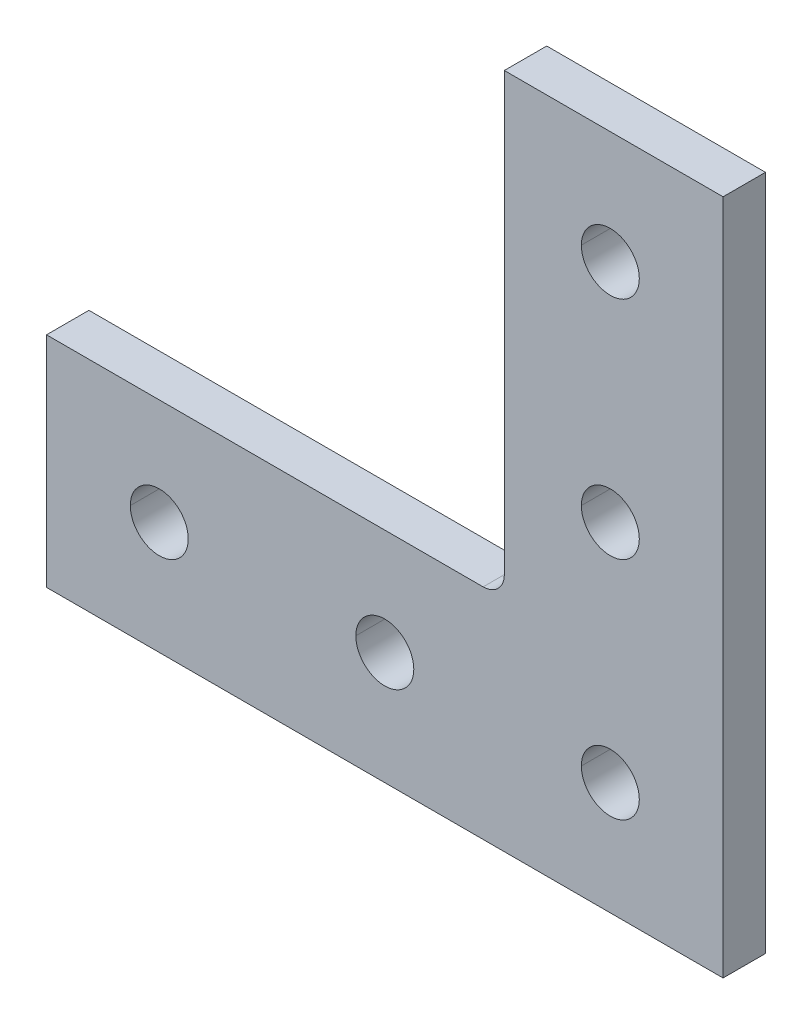
ISO-10303-21;
HEADER;
FILE_DESCRIPTION(('STEP AP214'),'2;1');
FILE_NAME('part.step','',(''),(''),'','','');
FILE_SCHEMA(('AUTOMOTIVE_DESIGN { 1 0 10303 214 1 1 1 1 }'));
ENDSEC;
DATA;
#1=APPLICATION_CONTEXT('core data for automotive mechanical design processes');
#2=APPLICATION_PROTOCOL_DEFINITION('international standard','automotive_design',2000,#1);
#3=PRODUCT_CONTEXT('',#1,'mechanical');
#4=PRODUCT('Part','Part','',(#3));
#5=PRODUCT_RELATED_PRODUCT_CATEGORY('part','',(#4));
#6=PRODUCT_DEFINITION_FORMATION('','',#4);
#7=PRODUCT_DEFINITION_CONTEXT('part definition',#1,'design');
#8=PRODUCT_DEFINITION('design','',#6,#7);
#9=PRODUCT_DEFINITION_SHAPE('','',#8);
#10=(LENGTH_UNIT() NAMED_UNIT(*) SI_UNIT(.MILLI.,.METRE.));
#11=(NAMED_UNIT(*) PLANE_ANGLE_UNIT() SI_UNIT($,.RADIAN.));
#12=(NAMED_UNIT(*) SI_UNIT($,.STERADIAN.) SOLID_ANGLE_UNIT());
#13=UNCERTAINTY_MEASURE_WITH_UNIT(LENGTH_MEASURE(1.E-05),#10,'distance_accuracy_value','');
#14=(GEOMETRIC_REPRESENTATION_CONTEXT(3) GLOBAL_UNCERTAINTY_ASSIGNED_CONTEXT((#13)) GLOBAL_UNIT_ASSIGNED_CONTEXT((#10,
#11,#12)) REPRESENTATION_CONTEXT('',''));
#15=CARTESIAN_POINT('',(0.,0.,0.));
#16=DIRECTION('',(0.,0.,1.));
#17=DIRECTION('',(1.,0.,0.));
#18=AXIS2_PLACEMENT_3D('',#15,#16,#17);
#19=CARTESIAN_POINT('',(-27.0256,24.638,4.7752));
#20=DIRECTION('',(0.,-1.,0.));
#21=DIRECTION('',(0.,0.,-1.));
#22=AXIS2_PLACEMENT_3D('',#19,#20,#21);
#23=PLANE('',#22);
#24=DIRECTION('',(-1.,0.,0.));
#25=VECTOR('',#24,1.);
#26=CARTESIAN_POINT('',(-27.0256,24.638,0.));
#27=LINE('',#26,#25);
#28=CARTESIAN_POINT('',(-27.0256,24.638,0.));
#29=VERTEX_POINT('',#28);
#30=CARTESIAN_POINT('',(-76.2,24.638,0.));
#31=VERTEX_POINT('',#30);
#32=EDGE_CURVE('E11',#29,#31,#27,.T.);
#33=ORIENTED_EDGE('',*,*,#32,.T.);
#34=DIRECTION('',(0.,0.,-1.));
#35=VECTOR('',#34,1.);
#36=CARTESIAN_POINT('',(-76.2,24.638,4.7752));
#37=LINE('',#36,#35);
#38=CARTESIAN_POINT('',(-76.2,24.638,4.7752));
#39=VERTEX_POINT('',#38);
#40=EDGE_CURVE('E25',#39,#31,#37,.T.);
#41=ORIENTED_EDGE('',*,*,#40,.F.);
#42=DIRECTION('',(-1.,0.,0.));
#43=VECTOR('',#42,1.);
#44=CARTESIAN_POINT('',(-27.0256,24.638,4.7752));
#45=LINE('',#44,#43);
#46=CARTESIAN_POINT('',(-27.0256,24.638,4.7752));
#47=VERTEX_POINT('',#46);
#48=EDGE_CURVE('E334',#47,#39,#45,.T.);
#49=ORIENTED_EDGE('',*,*,#48,.F.);
#50=DIRECTION('',(0.,0.,-1.));
#51=VECTOR('',#50,1.);
#52=CARTESIAN_POINT('',(-27.0256,24.638,4.7752));
#53=LINE('',#52,#51);
#54=EDGE_CURVE('E330',#47,#29,#53,.T.);
#55=ORIENTED_EDGE('',*,*,#54,.T.);
#56=EDGE_LOOP('',(#33,#41,#49,#55));
#57=FACE_BOUND('',#56,.T.);
#58=ADVANCED_FACE('F17',(#57),#23,.F.);
#59=CARTESIAN_POINT('',(-27.0255999999996,27.0255999999996,4.7752));
#60=DIRECTION('',(0.,0.,-1.));
#61=DIRECTION('',(-0.707106781186548,0.707106781186548,0.));
#62=AXIS2_PLACEMENT_3D('',#59,#60,#61);
#63=CYLINDRICAL_SURFACE('',#62,2.38759999999961);
#64=CARTESIAN_POINT('',(-27.0255999999996,27.0255999999996,0.));
#65=DIRECTION('',(0.,0.,1.));
#66=DIRECTION('',(1.,0.,0.));
#67=AXIS2_PLACEMENT_3D('',#64,#65,#66);
#68=CIRCLE('',#67,2.38759999999961);
#69=CARTESIAN_POINT('',(-24.638,27.0256,0.));
#70=VERTEX_POINT('',#69);
#71=EDGE_CURVE('E325',#29,#70,#68,.T.);
#72=ORIENTED_EDGE('',*,*,#71,.F.);
#73=ORIENTED_EDGE('',*,*,#54,.F.);
#74=CARTESIAN_POINT('',(-27.0255999999996,27.0255999999996,4.7752));
#75=DIRECTION('',(0.,0.,1.));
#76=DIRECTION('',(1.,0.,0.));
#77=AXIS2_PLACEMENT_3D('',#74,#75,#76);
#78=CIRCLE('',#77,2.38759999999961);
#79=CARTESIAN_POINT('',(-24.638,27.0256,4.7752));
#80=VERTEX_POINT('',#79);
#81=EDGE_CURVE('E321',#47,#80,#78,.T.);
#82=ORIENTED_EDGE('',*,*,#81,.T.);
#83=DIRECTION('',(0.,0.,-1.));
#84=VECTOR('',#83,1.);
#85=CARTESIAN_POINT('',(-24.638,27.0256,4.7752));
#86=LINE('',#85,#84);
#87=EDGE_CURVE('E317',#80,#70,#86,.T.);
#88=ORIENTED_EDGE('',*,*,#87,.T.);
#89=EDGE_LOOP('',(#72,#73,#82,#88));
#90=FACE_BOUND('',#89,.T.);
#91=ADVANCED_FACE('F353',(#90),#63,.F.);
#92=CARTESIAN_POINT('',(-24.638,76.2,4.7752));
#93=DIRECTION('',(1.,0.,0.));
#94=DIRECTION('',(0.,0.,-1.));
#95=AXIS2_PLACEMENT_3D('',#92,#93,#94);
#96=PLANE('',#95);
#97=DIRECTION('',(0.,-1.,0.));
#98=VECTOR('',#97,1.);
#99=CARTESIAN_POINT('',(-24.638,76.2,0.));
#100=LINE('',#99,#98);
#101=CARTESIAN_POINT('',(-24.638,76.2,0.));
#102=VERTEX_POINT('',#101);
#103=EDGE_CURVE('E312',#102,#70,#100,.T.);
#104=ORIENTED_EDGE('',*,*,#103,.T.);
#105=ORIENTED_EDGE('',*,*,#87,.F.);
#106=DIRECTION('',(0.,-1.,0.));
#107=VECTOR('',#106,1.);
#108=CARTESIAN_POINT('',(-24.638,76.2,4.7752));
#109=LINE('',#108,#107);
#110=CARTESIAN_POINT('',(-24.638,76.2,4.7752));
#111=VERTEX_POINT('',#110);
#112=EDGE_CURVE('E307',#111,#80,#109,.T.);
#113=ORIENTED_EDGE('',*,*,#112,.F.);
#114=DIRECTION('',(0.,0.,-1.));
#115=VECTOR('',#114,1.);
#116=CARTESIAN_POINT('',(-24.638,76.2,4.7752));
#117=LINE('',#116,#115);
#118=EDGE_CURVE('E303',#111,#102,#117,.T.);
#119=ORIENTED_EDGE('',*,*,#118,.T.);
#120=EDGE_LOOP('',(#104,#105,#113,#119));
#121=FACE_BOUND('',#120,.T.);
#122=ADVANCED_FACE('F369',(#121),#96,.F.);
#123=CARTESIAN_POINT('',(0.,76.2,4.7752));
#124=DIRECTION('',(0.,-1.,0.));
#125=DIRECTION('',(0.,0.,-1.));
#126=AXIS2_PLACEMENT_3D('',#123,#124,#125);
#127=PLANE('',#126);
#128=DIRECTION('',(-1.,0.,0.));
#129=VECTOR('',#128,1.);
#130=CARTESIAN_POINT('',(0.,76.2,0.));
#131=LINE('',#130,#129);
#132=CARTESIAN_POINT('',(0.,76.2,0.));
#133=VERTEX_POINT('',#132);
#134=EDGE_CURVE('E298',#133,#102,#131,.T.);
#135=ORIENTED_EDGE('',*,*,#134,.T.);
#136=ORIENTED_EDGE('',*,*,#118,.F.);
#137=DIRECTION('',(-1.,0.,0.));
#138=VECTOR('',#137,1.);
#139=CARTESIAN_POINT('',(0.,76.2,4.7752));
#140=LINE('',#139,#138);
#141=CARTESIAN_POINT('',(0.,76.2,4.7752));
#142=VERTEX_POINT('',#141);
#143=EDGE_CURVE('E293',#142,#111,#140,.T.);
#144=ORIENTED_EDGE('',*,*,#143,.F.);
#145=DIRECTION('',(0.,0.,-1.));
#146=VECTOR('',#145,1.);
#147=CARTESIAN_POINT('',(0.,76.2,4.7752));
#148=LINE('',#147,#146);
#149=EDGE_CURVE('E289',#142,#133,#148,.T.);
#150=ORIENTED_EDGE('',*,*,#149,.T.);
#151=EDGE_LOOP('',(#135,#136,#144,#150));
#152=FACE_BOUND('',#151,.T.);
#153=ADVANCED_FACE('F367',(#152),#127,.F.);
#154=CARTESIAN_POINT('',(0.,0.,4.7752));
#155=DIRECTION('',(-1.,0.,0.));
#156=DIRECTION('',(0.,0.,1.));
#157=AXIS2_PLACEMENT_3D('',#154,#155,#156);
#158=PLANE('',#157);
#159=DIRECTION('',(0.,1.,0.));
#160=VECTOR('',#159,1.);
#161=CARTESIAN_POINT('',(0.,0.,0.));
#162=LINE('',#161,#160);
#163=CARTESIAN_POINT('',(0.,0.,0.));
#164=VERTEX_POINT('',#163);
#165=EDGE_CURVE('E284',#164,#133,#162,.T.);
#166=ORIENTED_EDGE('',*,*,#165,.T.);
#167=ORIENTED_EDGE('',*,*,#149,.F.);
#168=DIRECTION('',(0.,1.,0.));
#169=VECTOR('',#168,1.);
#170=CARTESIAN_POINT('',(0.,0.,4.7752));
#171=LINE('',#170,#169);
#172=CARTESIAN_POINT('',(0.,0.,4.7752));
#173=VERTEX_POINT('',#172);
#174=EDGE_CURVE('E279',#173,#142,#171,.T.);
#175=ORIENTED_EDGE('',*,*,#174,.F.);
#176=DIRECTION('',(0.,0.,-1.));
#177=VECTOR('',#176,1.);
#178=CARTESIAN_POINT('',(0.,0.,4.7752));
#179=LINE('',#178,#177);
#180=EDGE_CURVE('E275',#173,#164,#179,.T.);
#181=ORIENTED_EDGE('',*,*,#180,.T.);
#182=EDGE_LOOP('',(#166,#167,#175,#181));
#183=FACE_BOUND('',#182,.T.);
#184=ADVANCED_FACE('F365',(#183),#158,.F.);
#185=CARTESIAN_POINT('',(-76.2,0.,4.7752));
#186=DIRECTION('',(0.,1.,0.));
#187=DIRECTION('',(0.,0.,1.));
#188=AXIS2_PLACEMENT_3D('',#185,#186,#187);
#189=PLANE('',#188);
#190=DIRECTION('',(1.,0.,0.));
#191=VECTOR('',#190,1.);
#192=CARTESIAN_POINT('',(-76.2,0.,0.));
#193=LINE('',#192,#191);
#194=CARTESIAN_POINT('',(-76.2,0.,0.));
#195=VERTEX_POINT('',#194);
#196=EDGE_CURVE('E270',#195,#164,#193,.T.);
#197=ORIENTED_EDGE('',*,*,#196,.T.);
#198=ORIENTED_EDGE('',*,*,#180,.F.);
#199=DIRECTION('',(1.,0.,0.));
#200=VECTOR('',#199,1.);
#201=CARTESIAN_POINT('',(-76.2,0.,4.7752));
#202=LINE('',#201,#200);
#203=CARTESIAN_POINT('',(-76.2,0.,4.7752));
#204=VERTEX_POINT('',#203);
#205=EDGE_CURVE('E265',#204,#173,#202,.T.);
#206=ORIENTED_EDGE('',*,*,#205,.F.);
#207=DIRECTION('',(0.,0.,-1.));
#208=VECTOR('',#207,1.);
#209=CARTESIAN_POINT('',(-76.2,0.,4.7752));
#210=LINE('',#209,#208);
#211=EDGE_CURVE('E261',#204,#195,#210,.T.);
#212=ORIENTED_EDGE('',*,*,#211,.T.);
#213=EDGE_LOOP('',(#197,#198,#206,#212));
#214=FACE_BOUND('',#213,.T.);
#215=ADVANCED_FACE('F361',(#214),#189,.F.);
#216=CARTESIAN_POINT('',(-76.2,24.638,4.7752));
#217=DIRECTION('',(1.,0.,0.));
#218=DIRECTION('',(0.,0.,-1.));
#219=AXIS2_PLACEMENT_3D('',#216,#217,#218);
#220=PLANE('',#219);
#221=DIRECTION('',(0.,-1.,0.));
#222=VECTOR('',#221,1.);
#223=CARTESIAN_POINT('',(-76.2,24.638,0.));
#224=LINE('',#223,#222);
#225=EDGE_CURVE('E256',#31,#195,#224,.T.);
#226=ORIENTED_EDGE('',*,*,#225,.T.);
#227=ORIENTED_EDGE('',*,*,#211,.F.);
#228=DIRECTION('',(0.,-1.,0.));
#229=VECTOR('',#228,1.);
#230=CARTESIAN_POINT('',(-76.2,24.638,4.7752));
#231=LINE('',#230,#229);
#232=EDGE_CURVE('E251',#39,#204,#231,.T.);
#233=ORIENTED_EDGE('',*,*,#232,.F.);
#234=ORIENTED_EDGE('',*,*,#40,.T.);
#235=EDGE_LOOP('',(#226,#227,#233,#234));
#236=FACE_BOUND('',#235,.T.);
#237=ADVANCED_FACE('F344',(#236),#220,.F.);
#238=CARTESIAN_POINT('',(-27.0255999999996,27.0255999999996,4.7752));
#239=DIRECTION('',(0.,0.,1.));
#240=DIRECTION('',(1.,0.,0.));
#241=AXIS2_PLACEMENT_3D('',#238,#239,#240);
#242=PLANE('',#241);
#243=CARTESIAN_POINT('',(-63.5,12.7,4.7752));
#244=DIRECTION('',(0.,0.,1.));
#245=DIRECTION('',(1.,0.,0.));
#246=AXIS2_PLACEMENT_3D('',#243,#244,#245);
#247=CIRCLE('',#246,3.2639);
#248=CARTESIAN_POINT('',(-66.7639,12.7,4.7752));
#249=VERTEX_POINT('',#248);
#250=CARTESIAN_POINT('',(-60.2361,12.7,4.7752));
#251=VERTEX_POINT('',#250);
#252=EDGE_CURVE('E246',#249,#251,#247,.T.);
#253=ORIENTED_EDGE('',*,*,#252,.F.);
#254=CARTESIAN_POINT('',(-63.5,12.7,4.7752));
#255=DIRECTION('',(0.,0.,1.));
#256=DIRECTION('',(1.,0.,0.));
#257=AXIS2_PLACEMENT_3D('',#254,#255,#256);
#258=CIRCLE('',#257,3.2639);
#259=EDGE_CURVE('E241',#251,#249,#258,.T.);
#260=ORIENTED_EDGE('',*,*,#259,.F.);
#261=EDGE_LOOP('',(#253,#260));
#262=FACE_BOUND('',#261,.T.);
#263=CARTESIAN_POINT('',(-38.1,12.7,4.7752));
#264=DIRECTION('',(0.,0.,1.));
#265=DIRECTION('',(1.,0.,0.));
#266=AXIS2_PLACEMENT_3D('',#263,#264,#265);
#267=CIRCLE('',#266,3.2639);
#268=CARTESIAN_POINT('',(-41.3639,12.7,4.7752));
#269=VERTEX_POINT('',#268);
#270=CARTESIAN_POINT('',(-34.8361,12.7,4.7752));
#271=VERTEX_POINT('',#270);
#272=EDGE_CURVE('E236',#269,#271,#267,.T.);
#273=ORIENTED_EDGE('',*,*,#272,.F.);
#274=CARTESIAN_POINT('',(-38.1,12.7,4.7752));
#275=DIRECTION('',(0.,0.,1.));
#276=DIRECTION('',(1.,0.,0.));
#277=AXIS2_PLACEMENT_3D('',#274,#275,#276);
#278=CIRCLE('',#277,3.2639);
#279=EDGE_CURVE('E231',#271,#269,#278,.T.);
#280=ORIENTED_EDGE('',*,*,#279,.F.);
#281=EDGE_LOOP('',(#273,#280));
#282=FACE_BOUND('',#281,.T.);
#283=CARTESIAN_POINT('',(-12.7,38.1,4.7752));
#284=DIRECTION('',(0.,0.,1.));
#285=DIRECTION('',(1.,0.,0.));
#286=AXIS2_PLACEMENT_3D('',#283,#284,#285);
#287=CIRCLE('',#286,3.2639);
#288=CARTESIAN_POINT('',(-15.9639,38.1,4.7752));
#289=VERTEX_POINT('',#288);
#290=CARTESIAN_POINT('',(-9.4361,38.1,4.7752));
#291=VERTEX_POINT('',#290);
#292=EDGE_CURVE('E226',#289,#291,#287,.T.);
#293=ORIENTED_EDGE('',*,*,#292,.F.);
#294=CARTESIAN_POINT('',(-12.7,38.1,4.7752));
#295=DIRECTION('',(0.,0.,1.));
#296=DIRECTION('',(1.,0.,0.));
#297=AXIS2_PLACEMENT_3D('',#294,#295,#296);
#298=CIRCLE('',#297,3.2639);
#299=EDGE_CURVE('E221',#291,#289,#298,.T.);
#300=ORIENTED_EDGE('',*,*,#299,.F.);
#301=EDGE_LOOP('',(#293,#300));
#302=FACE_BOUND('',#301,.T.);
#303=CARTESIAN_POINT('',(-12.7,63.5,4.7752));
#304=DIRECTION('',(0.,0.,1.));
#305=DIRECTION('',(1.,0.,0.));
#306=AXIS2_PLACEMENT_3D('',#303,#304,#305);
#307=CIRCLE('',#306,3.2639);
#308=CARTESIAN_POINT('',(-15.9639,63.5,4.7752));
#309=VERTEX_POINT('',#308);
#310=CARTESIAN_POINT('',(-9.4361,63.5,4.7752));
#311=VERTEX_POINT('',#310);
#312=EDGE_CURVE('E152',#309,#311,#307,.T.);
#313=ORIENTED_EDGE('',*,*,#312,.F.);
#314=CARTESIAN_POINT('',(-12.7,63.5,4.7752));
#315=DIRECTION('',(0.,0.,1.));
#316=DIRECTION('',(1.,0.,0.));
#317=AXIS2_PLACEMENT_3D('',#314,#315,#316);
#318=CIRCLE('',#317,3.2639);
#319=EDGE_CURVE('E214',#311,#309,#318,.T.);
#320=ORIENTED_EDGE('',*,*,#319,.F.);
#321=EDGE_LOOP('',(#313,#320));
#322=FACE_BOUND('',#321,.T.);
#323=CARTESIAN_POINT('',(-12.7,12.7,4.7752));
#324=DIRECTION('',(0.,0.,1.));
#325=DIRECTION('',(1.,0.,0.));
#326=AXIS2_PLACEMENT_3D('',#323,#324,#325);
#327=CIRCLE('',#326,3.2639);
#328=CARTESIAN_POINT('',(-15.9639,12.7,4.7752));
#329=VERTEX_POINT('',#328);
#330=CARTESIAN_POINT('',(-9.4361,12.7,4.7752));
#331=VERTEX_POINT('',#330);
#332=EDGE_CURVE('E209',#329,#331,#327,.T.);
#333=ORIENTED_EDGE('',*,*,#332,.F.);
#334=CARTESIAN_POINT('',(-12.7,12.7,4.7752));
#335=DIRECTION('',(0.,0.,1.));
#336=DIRECTION('',(1.,0.,0.));
#337=AXIS2_PLACEMENT_3D('',#334,#335,#336);
#338=CIRCLE('',#337,3.2639);
#339=EDGE_CURVE('E204',#331,#329,#338,.T.);
#340=ORIENTED_EDGE('',*,*,#339,.F.);
#341=EDGE_LOOP('',(#333,#340));
#342=FACE_BOUND('',#341,.T.);
#343=ORIENTED_EDGE('',*,*,#48,.T.);
#344=ORIENTED_EDGE('',*,*,#232,.T.);
#345=ORIENTED_EDGE('',*,*,#205,.T.);
#346=ORIENTED_EDGE('',*,*,#174,.T.);
#347=ORIENTED_EDGE('',*,*,#143,.T.);
#348=ORIENTED_EDGE('',*,*,#112,.T.);
#349=ORIENTED_EDGE('',*,*,#81,.F.);
#350=EDGE_LOOP('',(#343,#344,#345,#346,#347,#348,#349));
#351=FACE_BOUND('',#350,.T.);
#352=ADVANCED_FACE('F349',(#262,#282,#302,#322,#342,#351),#242,.T.);
#353=CARTESIAN_POINT('',(-12.7,12.7,4.7752));
#354=DIRECTION('',(0.,0.,-1.));
#355=DIRECTION('',(0.,-1.,0.));
#356=AXIS2_PLACEMENT_3D('',#353,#354,#355);
#357=CYLINDRICAL_SURFACE('',#356,3.2639);
#358=DIRECTION('',(0.,0.,-1.));
#359=VECTOR('',#358,1.);
#360=CARTESIAN_POINT('',(-9.4361,12.7,4.7752));
#361=LINE('',#360,#359);
#362=CARTESIAN_POINT('',(-9.4361,12.7,0.));
#363=VERTEX_POINT('',#362);
#364=EDGE_CURVE('E199',#331,#363,#361,.T.);
#365=ORIENTED_EDGE('',*,*,#364,.F.);
#366=ORIENTED_EDGE('',*,*,#339,.T.);
#367=DIRECTION('',(0.,0.,-1.));
#368=VECTOR('',#367,1.);
#369=CARTESIAN_POINT('',(-15.9639,12.7,4.7752));
#370=LINE('',#369,#368);
#371=CARTESIAN_POINT('',(-15.9639,12.7,0.));
#372=VERTEX_POINT('',#371);
#373=EDGE_CURVE('E195',#329,#372,#370,.T.);
#374=ORIENTED_EDGE('',*,*,#373,.T.);
#375=CARTESIAN_POINT('',(-12.7,12.7,0.));
#376=DIRECTION('',(0.,0.,1.));
#377=DIRECTION('',(1.,0.,0.));
#378=AXIS2_PLACEMENT_3D('',#375,#376,#377);
#379=CIRCLE('',#378,3.2639);
#380=EDGE_CURVE('E190',#363,#372,#379,.T.);
#381=ORIENTED_EDGE('',*,*,#380,.F.);
#382=EDGE_LOOP('',(#365,#366,#374,#381));
#383=FACE_BOUND('',#382,.T.);
#384=ADVANCED_FACE('F439',(#383),#357,.F.);
#385=CARTESIAN_POINT('',(-27.0255999999996,27.0255999999996,0.));
#386=DIRECTION('',(0.,0.,1.));
#387=DIRECTION('',(1.,0.,0.));
#388=AXIS2_PLACEMENT_3D('',#385,#386,#387);
#389=PLANE('',#388);
#390=CARTESIAN_POINT('',(-63.5,12.7,0.));
#391=DIRECTION('',(0.,0.,1.));
#392=DIRECTION('',(1.,0.,0.));
#393=AXIS2_PLACEMENT_3D('',#390,#391,#392);
#394=CIRCLE('',#393,3.2639);
#395=CARTESIAN_POINT('',(-60.2361,12.7,0.));
#396=VERTEX_POINT('',#395);
#397=CARTESIAN_POINT('',(-66.7639,12.7,0.));
#398=VERTEX_POINT('',#397);
#399=EDGE_CURVE('E186',#396,#398,#394,.T.);
#400=ORIENTED_EDGE('',*,*,#399,.T.);
#401=CARTESIAN_POINT('',(-63.5,12.7,0.));
#402=DIRECTION('',(0.,0.,1.));
#403=DIRECTION('',(1.,0.,0.));
#404=AXIS2_PLACEMENT_3D('',#401,#402,#403);
#405=CIRCLE('',#404,3.2639);
#406=EDGE_CURVE('E182',#398,#396,#405,.T.);
#407=ORIENTED_EDGE('',*,*,#406,.T.);
#408=EDGE_LOOP('',(#400,#407));
#409=FACE_BOUND('',#408,.T.);
#410=CARTESIAN_POINT('',(-38.1,12.7,0.));
#411=DIRECTION('',(0.,0.,1.));
#412=DIRECTION('',(1.,0.,0.));
#413=AXIS2_PLACEMENT_3D('',#410,#411,#412);
#414=CIRCLE('',#413,3.2639);
#415=CARTESIAN_POINT('',(-34.8361,12.7,0.));
#416=VERTEX_POINT('',#415);
#417=CARTESIAN_POINT('',(-41.3639,12.7,0.));
#418=VERTEX_POINT('',#417);
#419=EDGE_CURVE('E178',#416,#418,#414,.T.);
#420=ORIENTED_EDGE('',*,*,#419,.T.);
#421=CARTESIAN_POINT('',(-38.1,12.7,0.));
#422=DIRECTION('',(0.,0.,1.));
#423=DIRECTION('',(1.,0.,0.));
#424=AXIS2_PLACEMENT_3D('',#421,#422,#423);
#425=CIRCLE('',#424,3.2639);
#426=EDGE_CURVE('E174',#418,#416,#425,.T.);
#427=ORIENTED_EDGE('',*,*,#426,.T.);
#428=EDGE_LOOP('',(#420,#427));
#429=FACE_BOUND('',#428,.T.);
#430=CARTESIAN_POINT('',(-12.7,38.1,0.));
#431=DIRECTION('',(0.,0.,1.));
#432=DIRECTION('',(1.,0.,0.));
#433=AXIS2_PLACEMENT_3D('',#430,#431,#432);
#434=CIRCLE('',#433,3.2639);
#435=CARTESIAN_POINT('',(-9.4361,38.1,0.));
#436=VERTEX_POINT('',#435);
#437=CARTESIAN_POINT('',(-15.9639,38.1,0.));
#438=VERTEX_POINT('',#437);
#439=EDGE_CURVE('E170',#436,#438,#434,.T.);
#440=ORIENTED_EDGE('',*,*,#439,.T.);
#441=CARTESIAN_POINT('',(-12.7,38.1,0.));
#442=DIRECTION('',(0.,0.,1.));
#443=DIRECTION('',(1.,0.,0.));
#444=AXIS2_PLACEMENT_3D('',#441,#442,#443);
#445=CIRCLE('',#444,3.2639);
#446=EDGE_CURVE('E149',#438,#436,#445,.T.);
#447=ORIENTED_EDGE('',*,*,#446,.T.);
#448=EDGE_LOOP('',(#440,#447));
#449=FACE_BOUND('',#448,.T.);
#450=CARTESIAN_POINT('',(-12.7,63.5,0.));
#451=DIRECTION('',(0.,0.,1.));
#452=DIRECTION('',(1.,0.,0.));
#453=AXIS2_PLACEMENT_3D('',#450,#451,#452);
#454=CIRCLE('',#453,3.2639);
#455=CARTESIAN_POINT('',(-9.4361,63.5,0.));
#456=VERTEX_POINT('',#455);
#457=CARTESIAN_POINT('',(-15.9639,63.5,0.));
#458=VERTEX_POINT('',#457);
#459=EDGE_CURVE('E135',#456,#458,#454,.T.);
#460=ORIENTED_EDGE('',*,*,#459,.T.);
#461=CARTESIAN_POINT('',(-12.7,63.5,0.));
#462=DIRECTION('',(0.,0.,1.));
#463=DIRECTION('',(1.,0.,0.));
#464=AXIS2_PLACEMENT_3D('',#461,#462,#463);
#465=CIRCLE('',#464,3.2639);
#466=EDGE_CURVE('E131',#458,#456,#465,.T.);
#467=ORIENTED_EDGE('',*,*,#466,.T.);
#468=EDGE_LOOP('',(#460,#467));
#469=FACE_BOUND('',#468,.T.);
#470=ORIENTED_EDGE('',*,*,#380,.T.);
#471=CARTESIAN_POINT('',(-12.7,12.7,0.));
#472=DIRECTION('',(0.,0.,1.));
#473=DIRECTION('',(1.,0.,0.));
#474=AXIS2_PLACEMENT_3D('',#471,#472,#473);
#475=CIRCLE('',#474,3.2639);
#476=EDGE_CURVE('E140',#372,#363,#475,.T.);
#477=ORIENTED_EDGE('',*,*,#476,.T.);
#478=EDGE_LOOP('',(#470,#477));
#479=FACE_BOUND('',#478,.T.);
#480=ORIENTED_EDGE('',*,*,#32,.F.);
#481=ORIENTED_EDGE('',*,*,#71,.T.);
#482=ORIENTED_EDGE('',*,*,#103,.F.);
#483=ORIENTED_EDGE('',*,*,#134,.F.);
#484=ORIENTED_EDGE('',*,*,#165,.F.);
#485=ORIENTED_EDGE('',*,*,#196,.F.);
#486=ORIENTED_EDGE('',*,*,#225,.F.);
#487=EDGE_LOOP('',(#480,#481,#482,#483,#484,#485,#486));
#488=FACE_BOUND('',#487,.T.);
#489=ADVANCED_FACE('F133',(#409,#429,#449,#469,#479,#488),#389,.F.);
#490=CARTESIAN_POINT('',(-12.7,12.7,4.7752));
#491=DIRECTION('',(0.,0.,-1.));
#492=DIRECTION('',(0.,1.,0.));
#493=AXIS2_PLACEMENT_3D('',#490,#491,#492);
#494=CYLINDRICAL_SURFACE('',#493,3.2639);
#495=ORIENTED_EDGE('',*,*,#364,.T.);
#496=ORIENTED_EDGE('',*,*,#476,.F.);
#497=ORIENTED_EDGE('',*,*,#373,.F.);
#498=ORIENTED_EDGE('',*,*,#332,.T.);
#499=EDGE_LOOP('',(#495,#496,#497,#498));
#500=FACE_BOUND('',#499,.T.);
#501=ADVANCED_FACE('F460',(#500),#494,.F.);
#502=CARTESIAN_POINT('',(-12.7,63.5,4.7752));
#503=DIRECTION('',(0.,0.,-1.));
#504=DIRECTION('',(0.,1.,0.));
#505=AXIS2_PLACEMENT_3D('',#502,#503,#504);
#506=CYLINDRICAL_SURFACE('',#505,3.2639);
#507=DIRECTION('',(0.,0.,-1.));
#508=VECTOR('',#507,1.);
#509=CARTESIAN_POINT('',(-9.4361,63.5,4.7752));
#510=LINE('',#509,#508);
#511=EDGE_CURVE('E146',#311,#456,#510,.T.);
#512=ORIENTED_EDGE('',*,*,#511,.T.);
#513=ORIENTED_EDGE('',*,*,#466,.F.);
#514=DIRECTION('',(0.,0.,-1.));
#515=VECTOR('',#514,1.);
#516=CARTESIAN_POINT('',(-15.9639,63.5,4.7752));
#517=LINE('',#516,#515);
#518=EDGE_CURVE('E148',#309,#458,#517,.T.);
#519=ORIENTED_EDGE('',*,*,#518,.F.);
#520=ORIENTED_EDGE('',*,*,#312,.T.);
#521=EDGE_LOOP('',(#512,#513,#519,#520));
#522=FACE_BOUND('',#521,.T.);
#523=ADVANCED_FACE('F151',(#522),#506,.F.);
#524=CARTESIAN_POINT('',(-12.7,63.5,4.7752));
#525=DIRECTION('',(0.,0.,-1.));
#526=DIRECTION('',(0.,-1.,0.));
#527=AXIS2_PLACEMENT_3D('',#524,#525,#526);
#528=CYLINDRICAL_SURFACE('',#527,3.2639);
#529=ORIENTED_EDGE('',*,*,#511,.F.);
#530=ORIENTED_EDGE('',*,*,#319,.T.);
#531=ORIENTED_EDGE('',*,*,#518,.T.);
#532=ORIENTED_EDGE('',*,*,#459,.F.);
#533=EDGE_LOOP('',(#529,#530,#531,#532));
#534=FACE_BOUND('',#533,.T.);
#535=ADVANCED_FACE('F144',(#534),#528,.F.);
#536=CARTESIAN_POINT('',(-12.7,38.1,4.7752));
#537=DIRECTION('',(0.,0.,-1.));
#538=DIRECTION('',(0.,1.,0.));
#539=AXIS2_PLACEMENT_3D('',#536,#537,#538);
#540=CYLINDRICAL_SURFACE('',#539,3.2639);
#541=DIRECTION('',(0.,0.,-1.));
#542=VECTOR('',#541,1.);
#543=CARTESIAN_POINT('',(-9.4361,38.1,4.7752));
#544=LINE('',#543,#542);
#545=EDGE_CURVE('E156',#291,#436,#544,.T.);
#546=ORIENTED_EDGE('',*,*,#545,.T.);
#547=ORIENTED_EDGE('',*,*,#446,.F.);
#548=DIRECTION('',(0.,0.,-1.));
#549=VECTOR('',#548,1.);
#550=CARTESIAN_POINT('',(-15.9639,38.1,4.7752));
#551=LINE('',#550,#549);
#552=EDGE_CURVE('E609',#289,#438,#551,.T.);
#553=ORIENTED_EDGE('',*,*,#552,.F.);
#554=ORIENTED_EDGE('',*,*,#292,.T.);
#555=EDGE_LOOP('',(#546,#547,#553,#554));
#556=FACE_BOUND('',#555,.T.);
#557=ADVANCED_FACE('F490',(#556),#540,.F.);
#558=CARTESIAN_POINT('',(-12.7,38.1,4.7752));
#559=DIRECTION('',(0.,0.,-1.));
#560=DIRECTION('',(0.,-1.,0.));
#561=AXIS2_PLACEMENT_3D('',#558,#559,#560);
#562=CYLINDRICAL_SURFACE('',#561,3.2639);
#563=ORIENTED_EDGE('',*,*,#545,.F.);
#564=ORIENTED_EDGE('',*,*,#299,.T.);
#565=ORIENTED_EDGE('',*,*,#552,.T.);
#566=ORIENTED_EDGE('',*,*,#439,.F.);
#567=EDGE_LOOP('',(#563,#564,#565,#566));
#568=FACE_BOUND('',#567,.T.);
#569=ADVANCED_FACE('F500',(#568),#562,.F.);
#570=CARTESIAN_POINT('',(-38.1,12.7,4.7752));
#571=DIRECTION('',(0.,0.,-1.));
#572=DIRECTION('',(0.,1.,0.));
#573=AXIS2_PLACEMENT_3D('',#570,#571,#572);
#574=CYLINDRICAL_SURFACE('',#573,3.2639);
#575=DIRECTION('',(0.,0.,-1.));
#576=VECTOR('',#575,1.);
#577=CARTESIAN_POINT('',(-34.8361,12.7,4.7752));
#578=LINE('',#577,#576);
#579=EDGE_CURVE('E611',#271,#416,#578,.T.);
#580=ORIENTED_EDGE('',*,*,#579,.T.);
#581=ORIENTED_EDGE('',*,*,#426,.F.);
#582=DIRECTION('',(0.,0.,-1.));
#583=VECTOR('',#582,1.);
#584=CARTESIAN_POINT('',(-41.3639,12.7,4.7752));
#585=LINE('',#584,#583);
#586=EDGE_CURVE('E592',#269,#418,#585,.T.);
#587=ORIENTED_EDGE('',*,*,#586,.F.);
#588=ORIENTED_EDGE('',*,*,#272,.T.);
#589=EDGE_LOOP('',(#580,#581,#587,#588));
#590=FACE_BOUND('',#589,.T.);
#591=ADVANCED_FACE('F511',(#590),#574,.F.);
#592=CARTESIAN_POINT('',(-38.1,12.7,4.7752));
#593=DIRECTION('',(0.,0.,-1.));
#594=DIRECTION('',(0.,-1.,0.));
#595=AXIS2_PLACEMENT_3D('',#592,#593,#594);
#596=CYLINDRICAL_SURFACE('',#595,3.2639);
#597=ORIENTED_EDGE('',*,*,#579,.F.);
#598=ORIENTED_EDGE('',*,*,#279,.T.);
#599=ORIENTED_EDGE('',*,*,#586,.T.);
#600=ORIENTED_EDGE('',*,*,#419,.F.);
#601=EDGE_LOOP('',(#597,#598,#599,#600));
#602=FACE_BOUND('',#601,.T.);
#603=ADVANCED_FACE('F522',(#602),#596,.F.);
#604=CARTESIAN_POINT('',(-63.5,12.7,4.7752));
#605=DIRECTION('',(0.,0.,-1.));
#606=DIRECTION('',(0.,1.,0.));
#607=AXIS2_PLACEMENT_3D('',#604,#605,#606);
#608=CYLINDRICAL_SURFACE('',#607,3.2639);
#609=DIRECTION('',(0.,0.,-1.));
#610=VECTOR('',#609,1.);
#611=CARTESIAN_POINT('',(-60.2361,12.7,4.7752));
#612=LINE('',#611,#610);
#613=EDGE_CURVE('E589',#251,#396,#612,.T.);
#614=ORIENTED_EDGE('',*,*,#613,.T.);
#615=ORIENTED_EDGE('',*,*,#406,.F.);
#616=DIRECTION('',(0.,0.,-1.));
#617=VECTOR('',#616,1.);
#618=CARTESIAN_POINT('',(-66.7639,12.7,4.7752));
#619=LINE('',#618,#617);
#620=EDGE_CURVE('E593',#249,#398,#619,.T.);
#621=ORIENTED_EDGE('',*,*,#620,.F.);
#622=ORIENTED_EDGE('',*,*,#252,.T.);
#623=EDGE_LOOP('',(#614,#615,#621,#622));
#624=FACE_BOUND('',#623,.T.);
#625=ADVANCED_FACE('F533',(#624),#608,.F.);
#626=CARTESIAN_POINT('',(-63.5,12.7,4.7752));
#627=DIRECTION('',(0.,0.,-1.));
#628=DIRECTION('',(0.,-1.,0.));
#629=AXIS2_PLACEMENT_3D('',#626,#627,#628);
#630=CYLINDRICAL_SURFACE('',#629,3.2639);
#631=ORIENTED_EDGE('',*,*,#613,.F.);
#632=ORIENTED_EDGE('',*,*,#259,.T.);
#633=ORIENTED_EDGE('',*,*,#620,.T.);
#634=ORIENTED_EDGE('',*,*,#399,.F.);
#635=EDGE_LOOP('',(#631,#632,#633,#634));
#636=FACE_BOUND('',#635,.T.);
#637=ADVANCED_FACE('F544',(#636),#630,.F.);
#638=CLOSED_SHELL('',(#58,#91,#122,#153,#184,#215,#237,#352,#384,#489,#501,#523,#535,#557,#569,
#591,#603,#625,#637));
#639=MANIFOLD_SOLID_BREP('B1',#638);
#640=ADVANCED_BREP_SHAPE_REPRESENTATION('',(#18,#639),#14);
#641=SHAPE_DEFINITION_REPRESENTATION(#9,#640);
ENDSEC;
END-ISO-10303-21;
